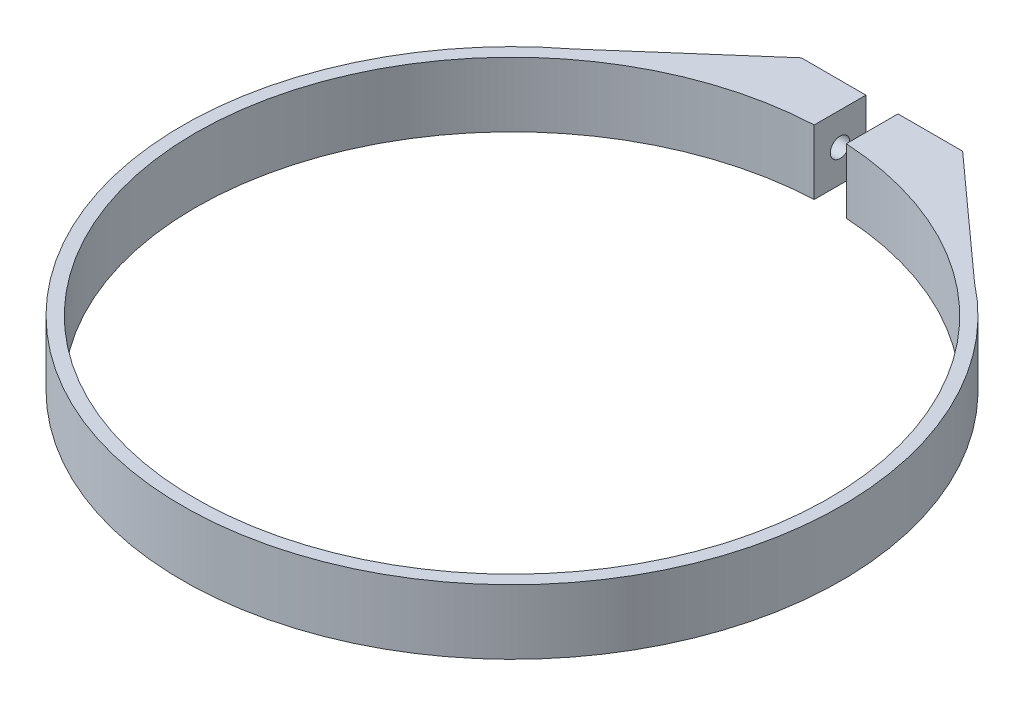
ISO-10303-21;
HEADER;
FILE_DESCRIPTION(('STEP AP214'),'2;1');
FILE_NAME('part.step','',(''),(''),'','','');
FILE_SCHEMA(('AUTOMOTIVE_DESIGN { 1 0 10303 214 1 1 1 1 }'));
ENDSEC;
DATA;
#1=APPLICATION_CONTEXT('core data for automotive mechanical design processes');
#2=APPLICATION_PROTOCOL_DEFINITION('international standard','automotive_design',2000,#1);
#3=PRODUCT_CONTEXT('',#1,'mechanical');
#4=PRODUCT('Part','Part','',(#3));
#5=PRODUCT_RELATED_PRODUCT_CATEGORY('part','',(#4));
#6=PRODUCT_DEFINITION_FORMATION('','',#4);
#7=PRODUCT_DEFINITION_CONTEXT('part definition',#1,'design');
#8=PRODUCT_DEFINITION('design','',#6,#7);
#9=PRODUCT_DEFINITION_SHAPE('','',#8);
#10=(LENGTH_UNIT() NAMED_UNIT(*) SI_UNIT(.MILLI.,.METRE.));
#11=(NAMED_UNIT(*) PLANE_ANGLE_UNIT() SI_UNIT($,.RADIAN.));
#12=(NAMED_UNIT(*) SI_UNIT($,.STERADIAN.) SOLID_ANGLE_UNIT());
#13=UNCERTAINTY_MEASURE_WITH_UNIT(LENGTH_MEASURE(1.E-05),#10,'distance_accuracy_value','');
#14=(GEOMETRIC_REPRESENTATION_CONTEXT(3) GLOBAL_UNCERTAINTY_ASSIGNED_CONTEXT((#13)) GLOBAL_UNIT_ASSIGNED_CONTEXT((#10,
#11,#12)) REPRESENTATION_CONTEXT('',''));
#15=CARTESIAN_POINT('',(0.,0.,0.));
#16=DIRECTION('',(0.,0.,1.));
#17=DIRECTION('',(1.,0.,0.));
#18=AXIS2_PLACEMENT_3D('',#15,#16,#17);
#19=CARTESIAN_POINT('',(-7.18276114909497,5.,-52.9513590594378));
#20=DIRECTION('',(1.,0.,0.));
#21=DIRECTION('',(0.,0.,-1.));
#22=AXIS2_PLACEMENT_3D('',#19,#20,#21);
#23=PLANE('',#22);
#24=CARTESIAN_POINT('',(-7.18276114909497,5.,-52.9513590594378));
#25=DIRECTION('',(1.,0.,0.));
#26=DIRECTION('',(0.,0.,-1.));
#27=AXIS2_PLACEMENT_3D('',#24,#25,#26);
#28=CIRCLE('',#27,2.5);
#29=CARTESIAN_POINT('',(-7.18276114909497,5.,-55.4513590594378));
#30=VERTEX_POINT('',#29);
#31=EDGE_CURVE('E18',#30,#30,#28,.F.);
#32=ORIENTED_EDGE('',*,*,#31,.T.);
#33=EDGE_LOOP('',(#32));
#34=FACE_BOUND('',#33,.T.);
#35=CARTESIAN_POINT('',(-7.18276114909497,5.,-52.9513590594378));
#36=DIRECTION('',(1.,0.,0.));
#37=DIRECTION('',(0.,0.,-1.));
#38=AXIS2_PLACEMENT_3D('',#35,#36,#37);
#39=CIRCLE('',#38,1.5);
#40=CARTESIAN_POINT('',(-7.18276114909497,5.,-54.4513590594378));
#41=VERTEX_POINT('',#40);
#42=EDGE_CURVE('E192',#41,#41,#39,.T.);
#43=ORIENTED_EDGE('',*,*,#42,.T.);
#44=EDGE_LOOP('',(#43));
#45=FACE_BOUND('',#44,.T.);
#46=ADVANCED_FACE('F15',(#34,#45),#23,.F.);
#47=CARTESIAN_POINT('',(-27.182761149095,5.,-52.9513590594378));
#48=DIRECTION('',(1.,0.,0.));
#49=DIRECTION('',(0.,0.,-1.));
#50=AXIS2_PLACEMENT_3D('',#47,#48,#49);
#51=CYLINDRICAL_SURFACE('',#50,2.5);
#52=CARTESIAN_POINT('',(-16.7572237161573,5.,-52.9513590594378));
#53=DIRECTION('',(0.658257137852581,0.,0.752793159152053));
#54=DIRECTION('',(0.752793159152053,0.,-0.658257137852581));
#55=AXIS2_PLACEMENT_3D('',#52,#53,#54);
#56=ELLIPSE('',#55,3.79790792418249,2.5);
#57=CARTESIAN_POINT('',(-13.8981846117433,5.,-55.4513590594378));
#58=VERTEX_POINT('',#57);
#59=EDGE_CURVE('E172',#58,#58,#56,.F.);
#60=ORIENTED_EDGE('',*,*,#59,.T.);
#61=EDGE_LOOP('',(#60));
#62=FACE_BOUND('',#61,.T.);
#63=ORIENTED_EDGE('',*,*,#31,.F.);
#64=EDGE_LOOP('',(#63));
#65=FACE_BOUND('',#64,.T.);
#66=ADVANCED_FACE('F200',(#62,#65),#51,.F.);
#67=CARTESIAN_POINT('',(2.81723885090503,5.,-52.9189448502004));
#68=DIRECTION('',(-1.,0.,0.));
#69=DIRECTION('',(0.,0.,1.));
#70=AXIS2_PLACEMENT_3D('',#67,#68,#69);
#71=CYLINDRICAL_SURFACE('',#70,1.24999999999999);
#72=CARTESIAN_POINT('',(17.2597214774372,5.,-52.9189448502004));
#73=DIRECTION('',(-0.669127897322475,0.,0.743147264695769));
#74=DIRECTION('',(-0.743147264695769,0.,-0.669127897322475));
#75=AXIS2_PLACEMENT_3D('',#72,#73,#74);
#76=ELLIPSE('',#75,1.86810325051741,1.24999999999999);
#77=CARTESIAN_POINT('',(15.8714456566459,5.,-54.1689448502004));
#78=VERTEX_POINT('',#77);
#79=EDGE_CURVE('E169',#78,#78,#76,.F.);
#80=ORIENTED_EDGE('',*,*,#79,.T.);
#81=EDGE_LOOP('',(#80));
#82=FACE_BOUND('',#81,.T.);
#83=CARTESIAN_POINT('',(2.81723885090503,5.,-52.9189448502004));
#84=DIRECTION('',(-1.,0.,0.));
#85=DIRECTION('',(0.,0.,1.));
#86=AXIS2_PLACEMENT_3D('',#83,#84,#85);
#87=CIRCLE('',#86,1.24999999999999);
#88=CARTESIAN_POINT('',(2.81723885090503,5.,-51.6689448502004));
#89=VERTEX_POINT('',#88);
#90=EDGE_CURVE('E161',#89,#89,#87,.T.);
#91=ORIENTED_EDGE('',*,*,#90,.T.);
#92=EDGE_LOOP('',(#91));
#93=FACE_BOUND('',#92,.T.);
#94=ADVANCED_FACE('F202',(#82,#93),#71,.F.);
#95=CARTESIAN_POINT('',(-7.18276114909497,5.,-52.9513590594378));
#96=DIRECTION('',(1.,0.,0.));
#97=DIRECTION('',(0.,0.,-1.));
#98=AXIS2_PLACEMENT_3D('',#95,#96,#97);
#99=CYLINDRICAL_SURFACE('',#98,1.5);
#100=ORIENTED_EDGE('',*,*,#42,.F.);
#101=EDGE_LOOP('',(#100));
#102=FACE_BOUND('',#101,.T.);
#103=CARTESIAN_POINT('',(-2.18276114909497,5.,-52.9513590594378));
#104=DIRECTION('',(1.,0.,0.));
#105=DIRECTION('',(0.,0.,-1.));
#106=AXIS2_PLACEMENT_3D('',#103,#104,#105);
#107=CIRCLE('',#106,1.5);
#108=CARTESIAN_POINT('',(-2.18276114909497,5.,-54.4513590594378));
#109=VERTEX_POINT('',#108);
#110=EDGE_CURVE('E126',#109,#109,#107,.T.);
#111=ORIENTED_EDGE('',*,*,#110,.T.);
#112=EDGE_LOOP('',(#111));
#113=FACE_BOUND('',#112,.T.);
#114=ADVANCED_FACE('F209',(#102,#113),#99,.F.);
#115=CARTESIAN_POINT('',(-12.182761149095,10.,-56.9513590594378));
#116=DIRECTION('',(0.658257137852581,0.,0.752793159152053));
#117=DIRECTION('',(0.752793159152053,0.,-0.658257137852581));
#118=AXIS2_PLACEMENT_3D('',#115,#116,#117);
#119=PLANE('',#118);
#120=DIRECTION('',(0.,-1.,0.));
#121=VECTOR('',#120,1.);
#122=CARTESIAN_POINT('',(-31.0025901278963,10.,-40.4949306131233));
#123=LINE('',#122,#121);
#124=CARTESIAN_POINT('',(-31.0025901278962,10.,-40.4949306131234));
#125=VERTEX_POINT('',#124);
#126=CARTESIAN_POINT('',(-31.0025901278962,0.,-40.4949306131234));
#127=VERTEX_POINT('',#126);
#128=EDGE_CURVE('E170',#125,#127,#123,.T.);
#129=ORIENTED_EDGE('',*,*,#128,.F.);
#130=DIRECTION('',(-0.752793159152053,0.,0.658257137852581));
#131=VECTOR('',#130,1.);
#132=CARTESIAN_POINT('',(-12.182761149095,10.,-56.9513590594378));
#133=LINE('',#132,#131);
#134=CARTESIAN_POINT('',(-12.182761149095,10.,-56.9513590594378));
#135=VERTEX_POINT('',#134);
#136=EDGE_CURVE('E60',#135,#125,#133,.T.);
#137=ORIENTED_EDGE('',*,*,#136,.F.);
#138=DIRECTION('',(0.,1.,0.));
#139=VECTOR('',#138,1.);
#140=CARTESIAN_POINT('',(-12.182761149095,10.,-56.9513590594378));
#141=LINE('',#140,#139);
#142=CARTESIAN_POINT('',(-12.182761149095,0.,-56.9513590594378));
#143=VERTEX_POINT('',#142);
#144=EDGE_CURVE('E69',#135,#143,#141,.F.);
#145=ORIENTED_EDGE('',*,*,#144,.T.);
#146=DIRECTION('',(-0.752793159152053,0.,0.658257137852581));
#147=VECTOR('',#146,1.);
#148=CARTESIAN_POINT('',(-12.182761149095,0.,-56.9513590594378));
#149=LINE('',#148,#147);
#150=EDGE_CURVE('E116',#143,#127,#149,.T.);
#151=ORIENTED_EDGE('',*,*,#150,.T.);
#152=EDGE_LOOP('',(#129,#137,#145,#151));
#153=FACE_BOUND('',#152,.T.);
#154=ORIENTED_EDGE('',*,*,#59,.F.);
#155=EDGE_LOOP('',(#154));
#156=FACE_BOUND('',#155,.T.);
#157=ADVANCED_FACE('F243',(#153,#156),#119,.F.);
#158=CARTESIAN_POINT('',(0.,10.,0.));
#159=DIRECTION('',(0.,-1.,0.));
#160=DIRECTION('',(0.,0.,-1.));
#161=AXIS2_PLACEMENT_3D('',#158,#159,#160);
#162=CYLINDRICAL_SURFACE('',#161,51.);
#163=CARTESIAN_POINT('',(0.,10.,0.));
#164=DIRECTION('',(0.,-1.,0.));
#165=DIRECTION('',(0.,0.,-1.));
#166=AXIS2_PLACEMENT_3D('',#163,#164,#165);
#167=CIRCLE('',#166,51.);
#168=CARTESIAN_POINT('',(31.3959204682994,10.,-40.1907474171385));
#169=VERTEX_POINT('',#168);
#170=EDGE_CURVE('E147',#125,#169,#167,.F.);
#171=ORIENTED_EDGE('',*,*,#170,.F.);
#172=ORIENTED_EDGE('',*,*,#128,.T.);
#173=CARTESIAN_POINT('',(0.,0.,0.));
#174=DIRECTION('',(0.,-1.,0.));
#175=DIRECTION('',(0.,0.,-1.));
#176=AXIS2_PLACEMENT_3D('',#173,#174,#175);
#177=CIRCLE('',#176,51.);
#178=CARTESIAN_POINT('',(31.3959204682994,0.,-40.1907474171385));
#179=VERTEX_POINT('',#178);
#180=EDGE_CURVE('E114',#127,#179,#177,.F.);
#181=ORIENTED_EDGE('',*,*,#180,.T.);
#182=DIRECTION('',(0.,1.,0.));
#183=VECTOR('',#182,1.);
#184=CARTESIAN_POINT('',(31.3959204682993,10.,-40.1907474171385));
#185=LINE('',#184,#183);
#186=EDGE_CURVE('E102',#179,#169,#185,.T.);
#187=ORIENTED_EDGE('',*,*,#186,.T.);
#188=EDGE_LOOP('',(#171,#172,#181,#187));
#189=FACE_BOUND('',#188,.T.);
#190=ADVANCED_FACE('F240',(#189),#162,.T.);
#191=CARTESIAN_POINT('',(12.817238850905,10.,-56.9189448502004));
#192=DIRECTION('',(-0.669127897322475,0.,0.743147264695769));
#193=DIRECTION('',(0.743147264695769,0.,0.669127897322475));
#194=AXIS2_PLACEMENT_3D('',#191,#192,#193);
#195=PLANE('',#194);
#196=DIRECTION('',(0.,1.,0.));
#197=VECTOR('',#196,1.);
#198=CARTESIAN_POINT('',(12.817238850905,10.,-56.9189448502004));
#199=LINE('',#198,#197);
#200=CARTESIAN_POINT('',(12.817238850905,0.,-56.9189448502004));
#201=VERTEX_POINT('',#200);
#202=CARTESIAN_POINT('',(12.817238850905,10.,-56.9189448502004));
#203=VERTEX_POINT('',#202);
#204=EDGE_CURVE('E96',#201,#203,#199,.T.);
#205=ORIENTED_EDGE('',*,*,#204,.T.);
#206=DIRECTION('',(-0.743147264695769,0.,-0.669127897322475));
#207=VECTOR('',#206,1.);
#208=CARTESIAN_POINT('',(31.3959204682993,10.,-40.1907474171385));
#209=LINE('',#208,#207);
#210=EDGE_CURVE('E76',#169,#203,#209,.T.);
#211=ORIENTED_EDGE('',*,*,#210,.F.);
#212=ORIENTED_EDGE('',*,*,#186,.F.);
#213=DIRECTION('',(-0.743147264695769,0.,-0.669127897322475));
#214=VECTOR('',#213,1.);
#215=CARTESIAN_POINT('',(31.3959204682993,0.,-40.1907474171385));
#216=LINE('',#215,#214);
#217=EDGE_CURVE('E107',#179,#201,#216,.T.);
#218=ORIENTED_EDGE('',*,*,#217,.T.);
#219=EDGE_LOOP('',(#205,#211,#212,#218));
#220=FACE_BOUND('',#219,.T.);
#221=ORIENTED_EDGE('',*,*,#79,.F.);
#222=EDGE_LOOP('',(#221));
#223=FACE_BOUND('',#222,.T.);
#224=ADVANCED_FACE('F111',(#220,#223),#195,.F.);
#225=CARTESIAN_POINT('',(2.81723885090503,10.,-56.9189448502004));
#226=DIRECTION('',(0.,0.,1.));
#227=DIRECTION('',(1.,0.,0.));
#228=AXIS2_PLACEMENT_3D('',#225,#226,#227);
#229=PLANE('',#228);
#230=DIRECTION('',(0.,1.,0.));
#231=VECTOR('',#230,1.);
#232=CARTESIAN_POINT('',(2.81723885090503,10.,-56.9189448502004));
#233=LINE('',#232,#231);
#234=CARTESIAN_POINT('',(2.81723885090503,0.,-56.9189448502004));
#235=VERTEX_POINT('',#234);
#236=CARTESIAN_POINT('',(2.81723885090503,10.,-56.9189448502004));
#237=VERTEX_POINT('',#236);
#238=EDGE_CURVE('E90',#235,#237,#233,.T.);
#239=ORIENTED_EDGE('',*,*,#238,.T.);
#240=DIRECTION('',(1.,0.,0.));
#241=VECTOR('',#240,1.);
#242=CARTESIAN_POINT('',(0.,10.,-56.9189448502004));
#243=LINE('',#242,#241);
#244=EDGE_CURVE('E81',#203,#237,#243,.F.);
#245=ORIENTED_EDGE('',*,*,#244,.F.);
#246=ORIENTED_EDGE('',*,*,#204,.F.);
#247=DIRECTION('',(1.,0.,0.));
#248=VECTOR('',#247,1.);
#249=CARTESIAN_POINT('',(0.,0.,-56.9189448502004));
#250=LINE('',#249,#248);
#251=EDGE_CURVE('E99',#201,#235,#250,.F.);
#252=ORIENTED_EDGE('',*,*,#251,.T.);
#253=EDGE_LOOP('',(#239,#245,#246,#252));
#254=FACE_BOUND('',#253,.T.);
#255=ADVANCED_FACE('F98',(#254),#229,.F.);
#256=CARTESIAN_POINT('',(-2.18276114909497,10.,-56.9513590594378));
#257=DIRECTION('',(0.,0.,1.));
#258=DIRECTION('',(1.,0.,0.));
#259=AXIS2_PLACEMENT_3D('',#256,#257,#258);
#260=PLANE('',#259);
#261=ORIENTED_EDGE('',*,*,#144,.F.);
#262=DIRECTION('',(1.,0.,0.));
#263=VECTOR('',#262,1.);
#264=CARTESIAN_POINT('',(0.,10.,-56.9513590594378));
#265=LINE('',#264,#263);
#266=CARTESIAN_POINT('',(-2.18276114909496,10.,-56.9513590594378));
#267=VERTEX_POINT('',#266);
#268=EDGE_CURVE('E151',#267,#135,#265,.F.);
#269=ORIENTED_EDGE('',*,*,#268,.F.);
#270=DIRECTION('',(0.,1.,0.));
#271=VECTOR('',#270,1.);
#272=CARTESIAN_POINT('',(-2.18276114909497,10.,-56.9513590594378));
#273=LINE('',#272,#271);
#274=CARTESIAN_POINT('',(-2.18276114909496,0.,-56.9513590594378));
#275=VERTEX_POINT('',#274);
#276=EDGE_CURVE('E139',#267,#275,#273,.F.);
#277=ORIENTED_EDGE('',*,*,#276,.T.);
#278=DIRECTION('',(1.,0.,0.));
#279=VECTOR('',#278,1.);
#280=CARTESIAN_POINT('',(0.,0.,-56.9513590594378));
#281=LINE('',#280,#279);
#282=EDGE_CURVE('E135',#275,#143,#281,.F.);
#283=ORIENTED_EDGE('',*,*,#282,.T.);
#284=EDGE_LOOP('',(#261,#269,#277,#283));
#285=FACE_BOUND('',#284,.T.);
#286=ADVANCED_FACE('F233',(#285),#260,.F.);
#287=CARTESIAN_POINT('',(2.81723885090503,10.,-56.9189448502004));
#288=DIRECTION('',(1.,0.,0.));
#289=DIRECTION('',(0.,0.,-1.));
#290=AXIS2_PLACEMENT_3D('',#287,#288,#289);
#291=PLANE('',#290);
#292=DIRECTION('',(0.,-1.,0.));
#293=VECTOR('',#292,1.);
#294=CARTESIAN_POINT('',(2.81723885090503,10.,-48.9189448502004));
#295=LINE('',#294,#293);
#296=CARTESIAN_POINT('',(2.81723885090503,0.,-48.9189448502004));
#297=VERTEX_POINT('',#296);
#298=CARTESIAN_POINT('',(2.81723885090503,10.,-48.9189448502004));
#299=VERTEX_POINT('',#298);
#300=EDGE_CURVE('E132',#297,#299,#295,.F.);
#301=ORIENTED_EDGE('',*,*,#300,.T.);
#302=DIRECTION('',(0.,0.,1.));
#303=VECTOR('',#302,1.);
#304=CARTESIAN_POINT('',(2.81723885090503,10.,0.));
#305=LINE('',#304,#303);
#306=EDGE_CURVE('E140',#237,#299,#305,.T.);
#307=ORIENTED_EDGE('',*,*,#306,.F.);
#308=ORIENTED_EDGE('',*,*,#238,.F.);
#309=DIRECTION('',(0.,0.,1.));
#310=VECTOR('',#309,1.);
#311=CARTESIAN_POINT('',(2.81723885090503,0.,0.));
#312=LINE('',#311,#310);
#313=EDGE_CURVE('E109',#235,#297,#312,.T.);
#314=ORIENTED_EDGE('',*,*,#313,.T.);
#315=EDGE_LOOP('',(#301,#307,#308,#314));
#316=FACE_BOUND('',#315,.T.);
#317=ORIENTED_EDGE('',*,*,#90,.F.);
#318=EDGE_LOOP('',(#317));
#319=FACE_BOUND('',#318,.T.);
#320=ADVANCED_FACE('F230',(#316,#319),#291,.F.);
#321=CARTESIAN_POINT('',(0.,10.,0.));
#322=DIRECTION('',(0.,1.,0.));
#323=DIRECTION('',(0.,0.,1.));
#324=AXIS2_PLACEMENT_3D('',#321,#322,#323);
#325=PLANE('',#324);
#326=CARTESIAN_POINT('',(0.,10.,0.));
#327=DIRECTION('',(0.,-1.,0.));
#328=DIRECTION('',(0.,0.,-1.));
#329=AXIS2_PLACEMENT_3D('',#326,#327,#328);
#330=CIRCLE('',#329,49.);
#331=CARTESIAN_POINT('',(-2.18276114909496,10.,-48.9513590594378));
#332=VERTEX_POINT('',#331);
#333=EDGE_CURVE('E131',#299,#332,#330,.T.);
#334=ORIENTED_EDGE('',*,*,#333,.T.);
#335=DIRECTION('',(0.,0.,1.));
#336=VECTOR('',#335,1.);
#337=CARTESIAN_POINT('',(-2.18276114909497,10.,-56.9513590594378));
#338=LINE('',#337,#336);
#339=EDGE_CURVE('E136',#332,#267,#338,.F.);
#340=ORIENTED_EDGE('',*,*,#339,.T.);
#341=ORIENTED_EDGE('',*,*,#268,.T.);
#342=ORIENTED_EDGE('',*,*,#136,.T.);
#343=ORIENTED_EDGE('',*,*,#170,.T.);
#344=ORIENTED_EDGE('',*,*,#210,.T.);
#345=ORIENTED_EDGE('',*,*,#244,.T.);
#346=ORIENTED_EDGE('',*,*,#306,.T.);
#347=EDGE_LOOP('',(#334,#340,#341,#342,#343,#344,#345,#346));
#348=FACE_BOUND('',#347,.T.);
#349=ADVANCED_FACE('F226',(#348),#325,.T.);
#350=CARTESIAN_POINT('',(-2.18276114909497,10.,-56.9513590594378));
#351=DIRECTION('',(-1.,0.,0.));
#352=DIRECTION('',(0.,0.,1.));
#353=AXIS2_PLACEMENT_3D('',#350,#351,#352);
#354=PLANE('',#353);
#355=ORIENTED_EDGE('',*,*,#110,.F.);
#356=EDGE_LOOP('',(#355));
#357=FACE_BOUND('',#356,.T.);
#358=ORIENTED_EDGE('',*,*,#276,.F.);
#359=ORIENTED_EDGE('',*,*,#339,.F.);
#360=DIRECTION('',(0.,-1.,0.));
#361=VECTOR('',#360,1.);
#362=CARTESIAN_POINT('',(-2.18276114909495,10.,-48.9513590594378));
#363=LINE('',#362,#361);
#364=CARTESIAN_POINT('',(-2.18276114909495,0.,-48.9513590594378));
#365=VERTEX_POINT('',#364);
#366=EDGE_CURVE('E24',#332,#365,#363,.T.);
#367=ORIENTED_EDGE('',*,*,#366,.T.);
#368=DIRECTION('',(0.,0.,1.));
#369=VECTOR('',#368,1.);
#370=CARTESIAN_POINT('',(-2.18276114909495,0.,0.));
#371=LINE('',#370,#369);
#372=EDGE_CURVE('E32',#365,#275,#371,.F.);
#373=ORIENTED_EDGE('',*,*,#372,.T.);
#374=EDGE_LOOP('',(#358,#359,#367,#373));
#375=FACE_BOUND('',#374,.T.);
#376=ADVANCED_FACE('F220',(#357,#375),#354,.F.);
#377=CARTESIAN_POINT('',(0.,0.,0.));
#378=DIRECTION('',(0.,1.,0.));
#379=DIRECTION('',(0.,0.,1.));
#380=AXIS2_PLACEMENT_3D('',#377,#378,#379);
#381=PLANE('',#380);
#382=ORIENTED_EDGE('',*,*,#372,.F.);
#383=CARTESIAN_POINT('',(0.,0.,0.));
#384=DIRECTION('',(0.,-1.,0.));
#385=DIRECTION('',(0.,0.,-1.));
#386=AXIS2_PLACEMENT_3D('',#383,#384,#385);
#387=CIRCLE('',#386,49.);
#388=EDGE_CURVE('E10',#365,#297,#387,.F.);
#389=ORIENTED_EDGE('',*,*,#388,.T.);
#390=ORIENTED_EDGE('',*,*,#313,.F.);
#391=ORIENTED_EDGE('',*,*,#251,.F.);
#392=ORIENTED_EDGE('',*,*,#217,.F.);
#393=ORIENTED_EDGE('',*,*,#180,.F.);
#394=ORIENTED_EDGE('',*,*,#150,.F.);
#395=ORIENTED_EDGE('',*,*,#282,.F.);
#396=EDGE_LOOP('',(#382,#389,#390,#391,#392,#393,#394,#395));
#397=FACE_BOUND('',#396,.T.);
#398=ADVANCED_FACE('F105',(#397),#381,.F.);
#399=CARTESIAN_POINT('',(0.,10.,0.));
#400=DIRECTION('',(0.,-1.,0.));
#401=DIRECTION('',(0.,0.,-1.));
#402=AXIS2_PLACEMENT_3D('',#399,#400,#401);
#403=CYLINDRICAL_SURFACE('',#402,49.);
#404=ORIENTED_EDGE('',*,*,#366,.F.);
#405=ORIENTED_EDGE('',*,*,#333,.F.);
#406=ORIENTED_EDGE('',*,*,#300,.F.);
#407=ORIENTED_EDGE('',*,*,#388,.F.);
#408=EDGE_LOOP('',(#404,#405,#406,#407));
#409=FACE_BOUND('',#408,.T.);
#410=ADVANCED_FACE('F213',(#409),#403,.F.);
#411=CLOSED_SHELL('',(#46,#66,#94,#114,#157,#190,#224,#255,#286,#320,#349,#376,#398,#410));
#412=MANIFOLD_SOLID_BREP('B1',#411);
#413=ADVANCED_BREP_SHAPE_REPRESENTATION('',(#18,#412),#14);
#414=SHAPE_DEFINITION_REPRESENTATION(#9,#413);
ENDSEC;
END-ISO-10303-21;
